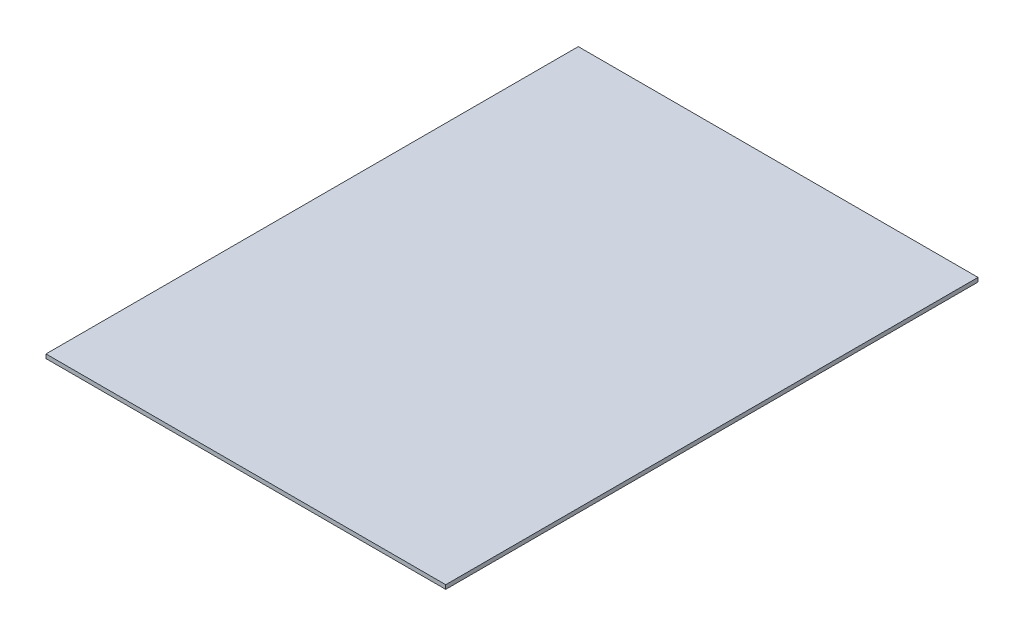
ISO-10303-21;
HEADER;
FILE_DESCRIPTION(('STEP AP214'),'2;1');
FILE_NAME('part.step','',(''),(''),'','','');
FILE_SCHEMA(('AUTOMOTIVE_DESIGN { 1 0 10303 214 1 1 1 1 }'));
ENDSEC;
DATA;
#1=APPLICATION_CONTEXT('core data for automotive mechanical design processes');
#2=APPLICATION_PROTOCOL_DEFINITION('international standard','automotive_design',2000,#1);
#3=PRODUCT_CONTEXT('',#1,'mechanical');
#4=PRODUCT('Part','Part','',(#3));
#5=PRODUCT_RELATED_PRODUCT_CATEGORY('part','',(#4));
#6=PRODUCT_DEFINITION_FORMATION('','',#4);
#7=PRODUCT_DEFINITION_CONTEXT('part definition',#1,'design');
#8=PRODUCT_DEFINITION('design','',#6,#7);
#9=PRODUCT_DEFINITION_SHAPE('','',#8);
#10=(LENGTH_UNIT() NAMED_UNIT(*) SI_UNIT(.MILLI.,.METRE.));
#11=(NAMED_UNIT(*) PLANE_ANGLE_UNIT() SI_UNIT($,.RADIAN.));
#12=(NAMED_UNIT(*) SI_UNIT($,.STERADIAN.) SOLID_ANGLE_UNIT());
#13=UNCERTAINTY_MEASURE_WITH_UNIT(LENGTH_MEASURE(1.E-05),#10,'distance_accuracy_value','');
#14=(GEOMETRIC_REPRESENTATION_CONTEXT(3) GLOBAL_UNCERTAINTY_ASSIGNED_CONTEXT((#13)) GLOBAL_UNIT_ASSIGNED_CONTEXT((#10,
#11,#12)) REPRESENTATION_CONTEXT('',''));
#15=CARTESIAN_POINT('',(0.,0.,0.));
#16=DIRECTION('',(0.,0.,1.));
#17=DIRECTION('',(1.,0.,0.));
#18=AXIS2_PLACEMENT_3D('',#15,#16,#17);
#19=CARTESIAN_POINT('',(0.,6.35,0.));
#20=DIRECTION('',(1.,0.,0.));
#21=DIRECTION('',(0.,0.,-1.));
#22=AXIS2_PLACEMENT_3D('',#19,#20,#21);
#23=PLANE('',#22);
#24=DIRECTION('',(0.,0.,1.));
#25=VECTOR('',#24,1.);
#26=CARTESIAN_POINT('',(0.,0.,0.));
#27=LINE('',#26,#25);
#28=CARTESIAN_POINT('',(0.,0.,-828.675));
#29=VERTEX_POINT('',#28);
#30=CARTESIAN_POINT('',(0.,0.,0.));
#31=VERTEX_POINT('',#30);
#32=EDGE_CURVE('E95',#29,#31,#27,.T.);
#33=ORIENTED_EDGE('',*,*,#32,.T.);
#34=DIRECTION('',(0.,-1.,0.));
#35=VECTOR('',#34,1.);
#36=CARTESIAN_POINT('',(0.,6.35,0.));
#37=LINE('',#36,#35);
#38=CARTESIAN_POINT('',(0.,6.35,0.));
#39=VERTEX_POINT('',#38);
#40=EDGE_CURVE('E11',#39,#31,#37,.T.);
#41=ORIENTED_EDGE('',*,*,#40,.F.);
#42=DIRECTION('',(0.,0.,1.));
#43=VECTOR('',#42,1.);
#44=CARTESIAN_POINT('',(0.,6.35,0.));
#45=LINE('',#44,#43);
#46=CARTESIAN_POINT('',(0.,6.35,-828.675));
#47=VERTEX_POINT('',#46);
#48=EDGE_CURVE('E83',#47,#39,#45,.T.);
#49=ORIENTED_EDGE('',*,*,#48,.F.);
#50=DIRECTION('',(0.,-1.,0.));
#51=VECTOR('',#50,1.);
#52=CARTESIAN_POINT('',(0.,6.35,-828.675));
#53=LINE('',#52,#51);
#54=EDGE_CURVE('E91',#47,#29,#53,.T.);
#55=ORIENTED_EDGE('',*,*,#54,.T.);
#56=EDGE_LOOP('',(#33,#41,#49,#55));
#57=FACE_BOUND('',#56,.T.);
#58=ADVANCED_FACE('F32',(#57),#23,.F.);
#59=CARTESIAN_POINT('',(0.,6.35,0.));
#60=DIRECTION('',(0.,0.,-1.));
#61=DIRECTION('',(-1.,0.,0.));
#62=AXIS2_PLACEMENT_3D('',#59,#60,#61);
#63=PLANE('',#62);
#64=DIRECTION('',(1.,0.,0.));
#65=VECTOR('',#64,1.);
#66=CARTESIAN_POINT('',(0.,0.,0.));
#67=LINE('',#66,#65);
#68=CARTESIAN_POINT('',(622.3,0.,0.));
#69=VERTEX_POINT('',#68);
#70=EDGE_CURVE('E87',#31,#69,#67,.T.);
#71=ORIENTED_EDGE('',*,*,#70,.T.);
#72=DIRECTION('',(0.,-1.,0.));
#73=VECTOR('',#72,1.);
#74=CARTESIAN_POINT('',(622.3,6.35,0.));
#75=LINE('',#74,#73);
#76=CARTESIAN_POINT('',(622.3,6.35,0.));
#77=VERTEX_POINT('',#76);
#78=EDGE_CURVE('E40',#77,#69,#75,.T.);
#79=ORIENTED_EDGE('',*,*,#78,.F.);
#80=DIRECTION('',(1.,0.,0.));
#81=VECTOR('',#80,1.);
#82=CARTESIAN_POINT('',(0.,6.35,0.));
#83=LINE('',#82,#81);
#84=EDGE_CURVE('E78',#39,#77,#83,.T.);
#85=ORIENTED_EDGE('',*,*,#84,.F.);
#86=ORIENTED_EDGE('',*,*,#40,.T.);
#87=EDGE_LOOP('',(#71,#79,#85,#86));
#88=FACE_BOUND('',#87,.T.);
#89=ADVANCED_FACE('F86',(#88),#63,.F.);
#90=CARTESIAN_POINT('',(622.3,6.35,0.));
#91=DIRECTION('',(-1.,0.,0.));
#92=DIRECTION('',(0.,0.,1.));
#93=AXIS2_PLACEMENT_3D('',#90,#91,#92);
#94=PLANE('',#93);
#95=DIRECTION('',(0.,0.,-1.));
#96=VECTOR('',#95,1.);
#97=CARTESIAN_POINT('',(622.3,0.,0.));
#98=LINE('',#97,#96);
#99=CARTESIAN_POINT('',(622.3,0.,-828.675));
#100=VERTEX_POINT('',#99);
#101=EDGE_CURVE('E65',#69,#100,#98,.T.);
#102=ORIENTED_EDGE('',*,*,#101,.T.);
#103=DIRECTION('',(0.,-1.,0.));
#104=VECTOR('',#103,1.);
#105=CARTESIAN_POINT('',(622.3,6.35,-828.675));
#106=LINE('',#105,#104);
#107=CARTESIAN_POINT('',(622.3,6.35,-828.675));
#108=VERTEX_POINT('',#107);
#109=EDGE_CURVE('E88',#108,#100,#106,.T.);
#110=ORIENTED_EDGE('',*,*,#109,.F.);
#111=DIRECTION('',(0.,0.,-1.));
#112=VECTOR('',#111,1.);
#113=CARTESIAN_POINT('',(622.3,6.35,0.));
#114=LINE('',#113,#112);
#115=EDGE_CURVE('E81',#77,#108,#114,.T.);
#116=ORIENTED_EDGE('',*,*,#115,.F.);
#117=ORIENTED_EDGE('',*,*,#78,.T.);
#118=EDGE_LOOP('',(#102,#110,#116,#117));
#119=FACE_BOUND('',#118,.T.);
#120=ADVANCED_FACE('F89',(#119),#94,.F.);
#121=CARTESIAN_POINT('',(0.,6.35,-828.675));
#122=DIRECTION('',(0.,0.,1.));
#123=DIRECTION('',(1.,0.,0.));
#124=AXIS2_PLACEMENT_3D('',#121,#122,#123);
#125=PLANE('',#124);
#126=DIRECTION('',(-1.,0.,0.));
#127=VECTOR('',#126,1.);
#128=CARTESIAN_POINT('',(0.,0.,-828.675));
#129=LINE('',#128,#127);
#130=EDGE_CURVE('E71',#100,#29,#129,.T.);
#131=ORIENTED_EDGE('',*,*,#130,.T.);
#132=ORIENTED_EDGE('',*,*,#54,.F.);
#133=DIRECTION('',(-1.,0.,0.));
#134=VECTOR('',#133,1.);
#135=CARTESIAN_POINT('',(0.,6.35,-828.675));
#136=LINE('',#135,#134);
#137=EDGE_CURVE('E48',#108,#47,#136,.T.);
#138=ORIENTED_EDGE('',*,*,#137,.F.);
#139=ORIENTED_EDGE('',*,*,#109,.T.);
#140=EDGE_LOOP('',(#131,#132,#138,#139));
#141=FACE_BOUND('',#140,.T.);
#142=ADVANCED_FACE('F102',(#141),#125,.F.);
#143=CARTESIAN_POINT('',(0.,6.35,0.));
#144=DIRECTION('',(0.,-1.,0.));
#145=DIRECTION('',(0.,0.,-1.));
#146=AXIS2_PLACEMENT_3D('',#143,#144,#145);
#147=PLANE('',#146);
#148=ORIENTED_EDGE('',*,*,#48,.T.);
#149=ORIENTED_EDGE('',*,*,#84,.T.);
#150=ORIENTED_EDGE('',*,*,#115,.T.);
#151=ORIENTED_EDGE('',*,*,#137,.T.);
#152=EDGE_LOOP('',(#148,#149,#150,#151));
#153=FACE_BOUND('',#152,.T.);
#154=ADVANCED_FACE('F79',(#153),#147,.F.);
#155=CARTESIAN_POINT('',(0.,0.,0.));
#156=DIRECTION('',(0.,-1.,0.));
#157=DIRECTION('',(0.,0.,-1.));
#158=AXIS2_PLACEMENT_3D('',#155,#156,#157);
#159=PLANE('',#158);
#160=ORIENTED_EDGE('',*,*,#32,.F.);
#161=ORIENTED_EDGE('',*,*,#130,.F.);
#162=ORIENTED_EDGE('',*,*,#101,.F.);
#163=ORIENTED_EDGE('',*,*,#70,.F.);
#164=EDGE_LOOP('',(#160,#161,#162,#163));
#165=FACE_BOUND('',#164,.T.);
#166=ADVANCED_FACE('F105',(#165),#159,.T.);
#167=CLOSED_SHELL('',(#58,#89,#120,#142,#154,#166));
#168=MANIFOLD_SOLID_BREP('B2',#167);
#169=ADVANCED_BREP_SHAPE_REPRESENTATION('',(#18,#168),#14);
#170=SHAPE_DEFINITION_REPRESENTATION(#9,#169);
ENDSEC;
END-ISO-10303-21;
